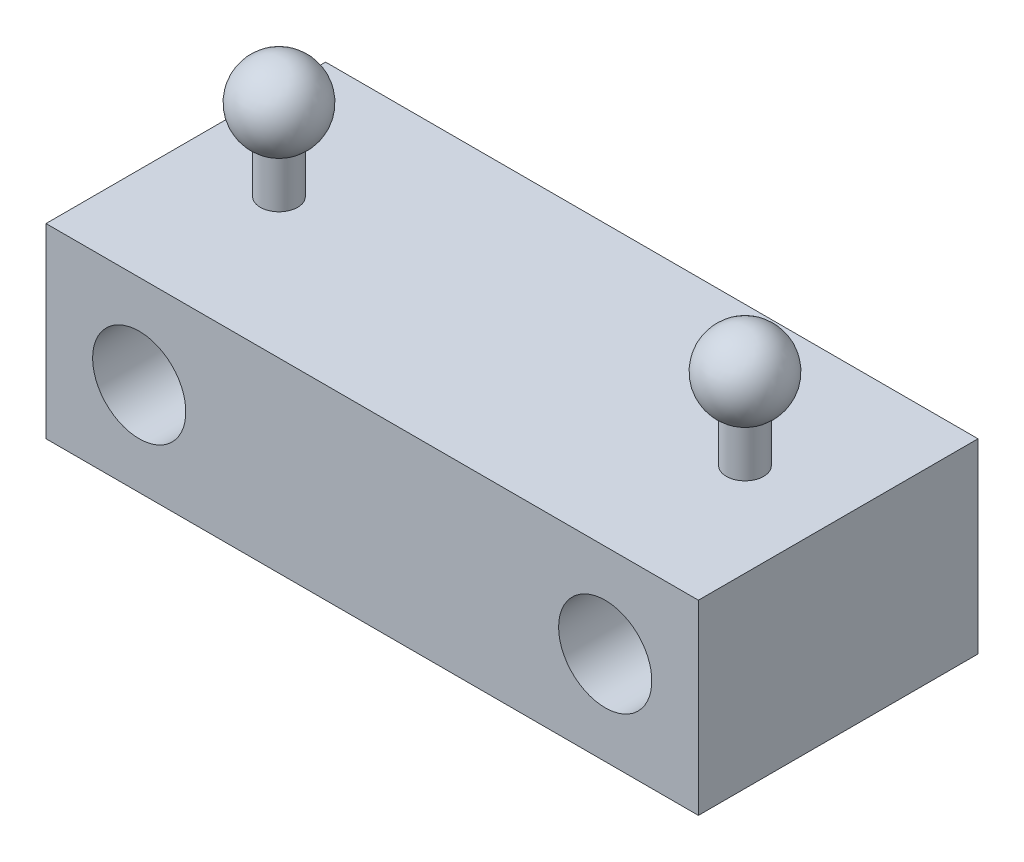
ISO-10303-21;
HEADER;
FILE_DESCRIPTION(('STEP AP214'),'2;1');
FILE_NAME('part.step','',(''),(''),'','','');
FILE_SCHEMA(('AUTOMOTIVE_DESIGN { 1 0 10303 214 1 1 1 1 }'));
ENDSEC;
DATA;
#1=APPLICATION_CONTEXT('core data for automotive mechanical design processes');
#2=APPLICATION_PROTOCOL_DEFINITION('international standard','automotive_design',2000,#1);
#3=PRODUCT_CONTEXT('',#1,'mechanical');
#4=PRODUCT('Part','Part','',(#3));
#5=PRODUCT_RELATED_PRODUCT_CATEGORY('part','',(#4));
#6=PRODUCT_DEFINITION_FORMATION('','',#4);
#7=PRODUCT_DEFINITION_CONTEXT('part definition',#1,'design');
#8=PRODUCT_DEFINITION('design','',#6,#7);
#9=PRODUCT_DEFINITION_SHAPE('','',#8);
#10=(LENGTH_UNIT() NAMED_UNIT(*) SI_UNIT(.MILLI.,.METRE.));
#11=(NAMED_UNIT(*) PLANE_ANGLE_UNIT() SI_UNIT($,.RADIAN.));
#12=(NAMED_UNIT(*) SI_UNIT($,.STERADIAN.) SOLID_ANGLE_UNIT());
#13=UNCERTAINTY_MEASURE_WITH_UNIT(LENGTH_MEASURE(1.E-05),#10,'distance_accuracy_value','');
#14=(GEOMETRIC_REPRESENTATION_CONTEXT(3) GLOBAL_UNCERTAINTY_ASSIGNED_CONTEXT((#13)) GLOBAL_UNIT_ASSIGNED_CONTEXT((#10,
#11,#12)) REPRESENTATION_CONTEXT('',''));
#15=CARTESIAN_POINT('',(0.,0.,0.));
#16=DIRECTION('',(0.,0.,1.));
#17=DIRECTION('',(1.,0.,0.));
#18=AXIS2_PLACEMENT_3D('',#15,#16,#17);
#19=CARTESIAN_POINT('',(-35.,20.,-15.));
#20=DIRECTION('',(1.,0.,0.));
#21=DIRECTION('',(0.,0.,-1.));
#22=AXIS2_PLACEMENT_3D('',#19,#20,#21);
#23=PLANE('',#22);
#24=DIRECTION('',(0.,0.,1.));
#25=VECTOR('',#24,1.);
#26=CARTESIAN_POINT('',(-35.,0.,-15.));
#27=LINE('',#26,#25);
#28=CARTESIAN_POINT('',(-35.,0.,-15.));
#29=VERTEX_POINT('',#28);
#30=CARTESIAN_POINT('',(-35.,0.,15.));
#31=VERTEX_POINT('',#30);
#32=EDGE_CURVE('E99',#29,#31,#27,.T.);
#33=ORIENTED_EDGE('',*,*,#32,.T.);
#34=DIRECTION('',(0.,-1.,0.));
#35=VECTOR('',#34,1.);
#36=CARTESIAN_POINT('',(-35.,20.,15.));
#37=LINE('',#36,#35);
#38=CARTESIAN_POINT('',(-35.,20.,15.));
#39=VERTEX_POINT('',#38);
#40=EDGE_CURVE('E11',#39,#31,#37,.T.);
#41=ORIENTED_EDGE('',*,*,#40,.F.);
#42=DIRECTION('',(0.,0.,1.));
#43=VECTOR('',#42,1.);
#44=CARTESIAN_POINT('',(-35.,20.,-15.));
#45=LINE('',#44,#43);
#46=CARTESIAN_POINT('',(-35.,20.,-15.));
#47=VERTEX_POINT('',#46);
#48=EDGE_CURVE('E84',#47,#39,#45,.T.);
#49=ORIENTED_EDGE('',*,*,#48,.F.);
#50=DIRECTION('',(0.,-1.,0.));
#51=VECTOR('',#50,1.);
#52=CARTESIAN_POINT('',(-35.,20.,-15.));
#53=LINE('',#52,#51);
#54=EDGE_CURVE('E51',#47,#29,#53,.T.);
#55=ORIENTED_EDGE('',*,*,#54,.T.);
#56=EDGE_LOOP('',(#33,#41,#49,#55));
#57=FACE_BOUND('',#56,.T.);
#58=ADVANCED_FACE('F32',(#57),#23,.F.);
#59=CARTESIAN_POINT('',(-35.,20.,15.));
#60=DIRECTION('',(0.,0.,-1.));
#61=DIRECTION('',(-1.,0.,0.));
#62=AXIS2_PLACEMENT_3D('',#59,#60,#61);
#63=PLANE('',#62);
#64=CARTESIAN_POINT('',(25.,10.,15.));
#65=DIRECTION('',(0.,0.,-1.));
#66=DIRECTION('',(-1.,0.,0.));
#67=AXIS2_PLACEMENT_3D('',#64,#65,#66);
#68=CIRCLE('',#67,5.);
#69=CARTESIAN_POINT('',(20.,10.,15.));
#70=VERTEX_POINT('',#69);
#71=EDGE_CURVE('E101',#70,#70,#68,.F.);
#72=ORIENTED_EDGE('',*,*,#71,.F.);
#73=EDGE_LOOP('',(#72));
#74=FACE_BOUND('',#73,.T.);
#75=CARTESIAN_POINT('',(-25.,10.,15.));
#76=DIRECTION('',(0.,0.,-1.));
#77=DIRECTION('',(-1.,0.,0.));
#78=AXIS2_PLACEMENT_3D('',#75,#76,#77);
#79=CIRCLE('',#78,5.);
#80=CARTESIAN_POINT('',(-30.,10.,15.));
#81=VERTEX_POINT('',#80);
#82=EDGE_CURVE('E116',#81,#81,#79,.F.);
#83=ORIENTED_EDGE('',*,*,#82,.F.);
#84=EDGE_LOOP('',(#83));
#85=FACE_BOUND('',#84,.T.);
#86=DIRECTION('',(1.,0.,0.));
#87=VECTOR('',#86,1.);
#88=CARTESIAN_POINT('',(-35.,0.,15.));
#89=LINE('',#88,#87);
#90=CARTESIAN_POINT('',(35.,0.,15.));
#91=VERTEX_POINT('',#90);
#92=EDGE_CURVE('E89',#31,#91,#89,.T.);
#93=ORIENTED_EDGE('',*,*,#92,.T.);
#94=DIRECTION('',(0.,-1.,0.));
#95=VECTOR('',#94,1.);
#96=CARTESIAN_POINT('',(35.,20.,15.));
#97=LINE('',#96,#95);
#98=CARTESIAN_POINT('',(35.,20.,15.));
#99=VERTEX_POINT('',#98);
#100=EDGE_CURVE('E42',#99,#91,#97,.T.);
#101=ORIENTED_EDGE('',*,*,#100,.F.);
#102=DIRECTION('',(1.,0.,0.));
#103=VECTOR('',#102,1.);
#104=CARTESIAN_POINT('',(-35.,20.,15.));
#105=LINE('',#104,#103);
#106=EDGE_CURVE('E76',#39,#99,#105,.T.);
#107=ORIENTED_EDGE('',*,*,#106,.F.);
#108=ORIENTED_EDGE('',*,*,#40,.T.);
#109=EDGE_LOOP('',(#93,#101,#107,#108));
#110=FACE_BOUND('',#109,.T.);
#111=ADVANCED_FACE('F88',(#74,#85,#110),#63,.F.);
#112=CARTESIAN_POINT('',(35.,20.,-15.));
#113=DIRECTION('',(1.,0.,0.));
#114=DIRECTION('',(0.,0.,-1.));
#115=AXIS2_PLACEMENT_3D('',#112,#113,#114);
#116=PLANE('',#115);
#117=DIRECTION('',(0.,0.,1.));
#118=VECTOR('',#117,1.);
#119=CARTESIAN_POINT('',(35.,0.,-15.));
#120=LINE('',#119,#118);
#121=CARTESIAN_POINT('',(35.,0.,-15.));
#122=VERTEX_POINT('',#121);
#123=EDGE_CURVE('E103',#122,#91,#120,.T.);
#124=ORIENTED_EDGE('',*,*,#123,.F.);
#125=DIRECTION('',(0.,-1.,0.));
#126=VECTOR('',#125,1.);
#127=CARTESIAN_POINT('',(35.,20.,-15.));
#128=LINE('',#127,#126);
#129=CARTESIAN_POINT('',(35.,20.,-15.));
#130=VERTEX_POINT('',#129);
#131=EDGE_CURVE('E65',#130,#122,#128,.T.);
#132=ORIENTED_EDGE('',*,*,#131,.F.);
#133=DIRECTION('',(0.,0.,1.));
#134=VECTOR('',#133,1.);
#135=CARTESIAN_POINT('',(35.,20.,-15.));
#136=LINE('',#135,#134);
#137=EDGE_CURVE('E83',#130,#99,#136,.T.);
#138=ORIENTED_EDGE('',*,*,#137,.T.);
#139=ORIENTED_EDGE('',*,*,#100,.T.);
#140=EDGE_LOOP('',(#124,#132,#138,#139));
#141=FACE_BOUND('',#140,.T.);
#142=ADVANCED_FACE('F93',(#141),#116,.T.);
#143=CARTESIAN_POINT('',(-35.,20.,-15.));
#144=DIRECTION('',(0.,0.,-1.));
#145=DIRECTION('',(-1.,0.,0.));
#146=AXIS2_PLACEMENT_3D('',#143,#144,#145);
#147=PLANE('',#146);
#148=CARTESIAN_POINT('',(25.,10.,-15.));
#149=DIRECTION('',(0.,0.,-1.));
#150=DIRECTION('',(-1.,0.,0.));
#151=AXIS2_PLACEMENT_3D('',#148,#149,#150);
#152=CIRCLE('',#151,5.);
#153=CARTESIAN_POINT('',(20.,10.,-15.));
#154=VERTEX_POINT('',#153);
#155=EDGE_CURVE('E126',#154,#154,#152,.T.);
#156=ORIENTED_EDGE('',*,*,#155,.F.);
#157=EDGE_LOOP('',(#156));
#158=FACE_BOUND('',#157,.T.);
#159=CARTESIAN_POINT('',(-25.,10.,-15.));
#160=DIRECTION('',(0.,0.,-1.));
#161=DIRECTION('',(-1.,0.,0.));
#162=AXIS2_PLACEMENT_3D('',#159,#160,#161);
#163=CIRCLE('',#162,5.);
#164=CARTESIAN_POINT('',(-30.,10.,-15.));
#165=VERTEX_POINT('',#164);
#166=EDGE_CURVE('E111',#165,#165,#163,.T.);
#167=ORIENTED_EDGE('',*,*,#166,.F.);
#168=EDGE_LOOP('',(#167));
#169=FACE_BOUND('',#168,.T.);
#170=DIRECTION('',(1.,0.,0.));
#171=VECTOR('',#170,1.);
#172=CARTESIAN_POINT('',(-35.,0.,-15.));
#173=LINE('',#172,#171);
#174=EDGE_CURVE('E105',#29,#122,#173,.T.);
#175=ORIENTED_EDGE('',*,*,#174,.F.);
#176=ORIENTED_EDGE('',*,*,#54,.F.);
#177=DIRECTION('',(1.,0.,0.));
#178=VECTOR('',#177,1.);
#179=CARTESIAN_POINT('',(-35.,20.,-15.));
#180=LINE('',#179,#178);
#181=EDGE_CURVE('E94',#47,#130,#180,.T.);
#182=ORIENTED_EDGE('',*,*,#181,.T.);
#183=ORIENTED_EDGE('',*,*,#131,.T.);
#184=EDGE_LOOP('',(#175,#176,#182,#183));
#185=FACE_BOUND('',#184,.T.);
#186=ADVANCED_FACE('F143',(#158,#169,#185),#147,.T.);
#187=CARTESIAN_POINT('',(0.,20.,0.));
#188=DIRECTION('',(0.,1.,0.));
#189=DIRECTION('',(0.,0.,1.));
#190=AXIS2_PLACEMENT_3D('',#187,#188,#189);
#191=PLANE('',#190);
#192=CARTESIAN_POINT('',(25.,20.,0.));
#193=DIRECTION('',(0.,1.,0.));
#194=DIRECTION('',(0.,0.,1.));
#195=AXIS2_PLACEMENT_3D('',#192,#193,#194);
#196=CIRCLE('',#195,2.);
#197=CARTESIAN_POINT('',(25.,20.,2.));
#198=VERTEX_POINT('',#197);
#199=EDGE_CURVE('E123',#198,#198,#196,.T.);
#200=ORIENTED_EDGE('',*,*,#199,.F.);
#201=EDGE_LOOP('',(#200));
#202=FACE_BOUND('',#201,.T.);
#203=CARTESIAN_POINT('',(-25.,20.,0.));
#204=DIRECTION('',(0.,1.,0.));
#205=DIRECTION('',(0.,0.,1.));
#206=AXIS2_PLACEMENT_3D('',#203,#204,#205);
#207=CIRCLE('',#206,2.);
#208=CARTESIAN_POINT('',(-25.,20.,2.));
#209=VERTEX_POINT('',#208);
#210=EDGE_CURVE('E112',#209,#209,#207,.T.);
#211=ORIENTED_EDGE('',*,*,#210,.F.);
#212=EDGE_LOOP('',(#211));
#213=FACE_BOUND('',#212,.T.);
#214=ORIENTED_EDGE('',*,*,#48,.T.);
#215=ORIENTED_EDGE('',*,*,#106,.T.);
#216=ORIENTED_EDGE('',*,*,#137,.F.);
#217=ORIENTED_EDGE('',*,*,#181,.F.);
#218=EDGE_LOOP('',(#214,#215,#216,#217));
#219=FACE_BOUND('',#218,.T.);
#220=ADVANCED_FACE('F80',(#202,#213,#219),#191,.T.);
#221=CARTESIAN_POINT('',(0.,0.,0.));
#222=DIRECTION('',(0.,1.,0.));
#223=DIRECTION('',(0.,0.,1.));
#224=AXIS2_PLACEMENT_3D('',#221,#222,#223);
#225=PLANE('',#224);
#226=ORIENTED_EDGE('',*,*,#32,.F.);
#227=ORIENTED_EDGE('',*,*,#174,.T.);
#228=ORIENTED_EDGE('',*,*,#123,.T.);
#229=ORIENTED_EDGE('',*,*,#92,.F.);
#230=EDGE_LOOP('',(#226,#227,#228,#229));
#231=FACE_BOUND('',#230,.T.);
#232=ADVANCED_FACE('F169',(#231),#225,.F.);
#233=CARTESIAN_POINT('',(-25.,10.,15.001));
#234=DIRECTION('',(0.,0.,-1.));
#235=DIRECTION('',(-1.,0.,0.));
#236=AXIS2_PLACEMENT_3D('',#233,#234,#235);
#237=CYLINDRICAL_SURFACE('',#236,5.);
#238=ORIENTED_EDGE('',*,*,#166,.T.);
#239=EDGE_LOOP('',(#238));
#240=FACE_BOUND('',#239,.T.);
#241=ORIENTED_EDGE('',*,*,#82,.T.);
#242=EDGE_LOOP('',(#241));
#243=FACE_BOUND('',#242,.T.);
#244=ADVANCED_FACE('F134',(#240,#243),#237,.F.);
#245=CARTESIAN_POINT('',(25.,10.,15.001));
#246=DIRECTION('',(0.,0.,-1.));
#247=DIRECTION('',(-1.,0.,0.));
#248=AXIS2_PLACEMENT_3D('',#245,#246,#247);
#249=CYLINDRICAL_SURFACE('',#248,5.);
#250=ORIENTED_EDGE('',*,*,#155,.T.);
#251=EDGE_LOOP('',(#250));
#252=FACE_BOUND('',#251,.T.);
#253=ORIENTED_EDGE('',*,*,#71,.T.);
#254=EDGE_LOOP('',(#253));
#255=FACE_BOUND('',#254,.T.);
#256=ADVANCED_FACE('F158',(#252,#255),#249,.F.);
#257=CARTESIAN_POINT('',(-25.,25.,0.));
#258=DIRECTION('',(0.,-1.,0.));
#259=DIRECTION('',(0.,0.,-1.));
#260=AXIS2_PLACEMENT_3D('',#257,#258,#259);
#261=CYLINDRICAL_SURFACE('',#260,2.);
#262=CARTESIAN_POINT('',(-25.,25.,0.));
#263=DIRECTION('',(0.,1.,0.));
#264=DIRECTION('',(0.,0.,1.));
#265=AXIS2_PLACEMENT_3D('',#262,#263,#264);
#266=CIRCLE('',#265,2.);
#267=CARTESIAN_POINT('',(-25.,25.,2.));
#268=VERTEX_POINT('',#267);
#269=EDGE_CURVE('E109',#268,#268,#266,.T.);
#270=ORIENTED_EDGE('',*,*,#269,.F.);
#271=EDGE_LOOP('',(#270));
#272=FACE_BOUND('',#271,.T.);
#273=ORIENTED_EDGE('',*,*,#210,.T.);
#274=EDGE_LOOP('',(#273));
#275=FACE_BOUND('',#274,.T.);
#276=ADVANCED_FACE('F151',(#272,#275),#261,.T.);
#277=CARTESIAN_POINT('',(-25.,28.75,0.));
#278=DIRECTION('',(0.,0.,1.));
#279=DIRECTION('',(1.,0.,0.));
#280=AXIS2_PLACEMENT_3D('',#277,#278,#279);
#281=SPHERICAL_SURFACE('',#280,4.25);
#282=CARTESIAN_POINT('',(-25.,28.75,0.));
#283=DIRECTION('',(0.,1.,0.));
#284=DIRECTION('',(0.,0.,1.));
#285=AXIS2_PLACEMENT_3D('',#282,#283,#284);
#286=SPHERICAL_SURFACE('',#285,4.25);
#287=ORIENTED_EDGE('',*,*,#269,.T.);
#288=EDGE_LOOP('',(#287));
#289=FACE_BOUND('',#288,.T.);
#290=ADVANCED_FACE('F148',(#289),#286,.T.);
#291=CARTESIAN_POINT('',(25.,25.,0.));
#292=DIRECTION('',(0.,-1.,0.));
#293=DIRECTION('',(0.,0.,-1.));
#294=AXIS2_PLACEMENT_3D('',#291,#292,#293);
#295=CYLINDRICAL_SURFACE('',#294,2.);
#296=CARTESIAN_POINT('',(25.,25.,0.));
#297=DIRECTION('',(0.,1.,0.));
#298=DIRECTION('',(0.,0.,1.));
#299=AXIS2_PLACEMENT_3D('',#296,#297,#298);
#300=CIRCLE('',#299,2.);
#301=CARTESIAN_POINT('',(25.,25.,2.));
#302=VERTEX_POINT('',#301);
#303=EDGE_CURVE('E36',#302,#302,#300,.T.);
#304=ORIENTED_EDGE('',*,*,#303,.F.);
#305=EDGE_LOOP('',(#304));
#306=FACE_BOUND('',#305,.T.);
#307=ORIENTED_EDGE('',*,*,#199,.T.);
#308=EDGE_LOOP('',(#307));
#309=FACE_BOUND('',#308,.T.);
#310=ADVANCED_FACE('F150',(#306,#309),#295,.T.);
#311=CARTESIAN_POINT('',(25.,28.75,0.));
#312=DIRECTION('',(0.,0.,1.));
#313=DIRECTION('',(1.,0.,0.));
#314=AXIS2_PLACEMENT_3D('',#311,#312,#313);
#315=SPHERICAL_SURFACE('',#314,4.25);
#316=CARTESIAN_POINT('',(25.,28.75,0.));
#317=DIRECTION('',(0.,1.,0.));
#318=DIRECTION('',(0.,0.,1.));
#319=AXIS2_PLACEMENT_3D('',#316,#317,#318);
#320=SPHERICAL_SURFACE('',#319,4.25);
#321=ORIENTED_EDGE('',*,*,#303,.T.);
#322=EDGE_LOOP('',(#321));
#323=FACE_BOUND('',#322,.T.);
#324=ADVANCED_FACE('F34',(#323),#320,.T.);
#325=CLOSED_SHELL('',(#58,#111,#142,#186,#220,#232,#244,#256,#276,#290,#310,#324));
#326=MANIFOLD_SOLID_BREP('B2',#325);
#327=ADVANCED_BREP_SHAPE_REPRESENTATION('',(#18,#326),#14);
#328=SHAPE_DEFINITION_REPRESENTATION(#9,#327);
ENDSEC;
END-ISO-10303-21;
